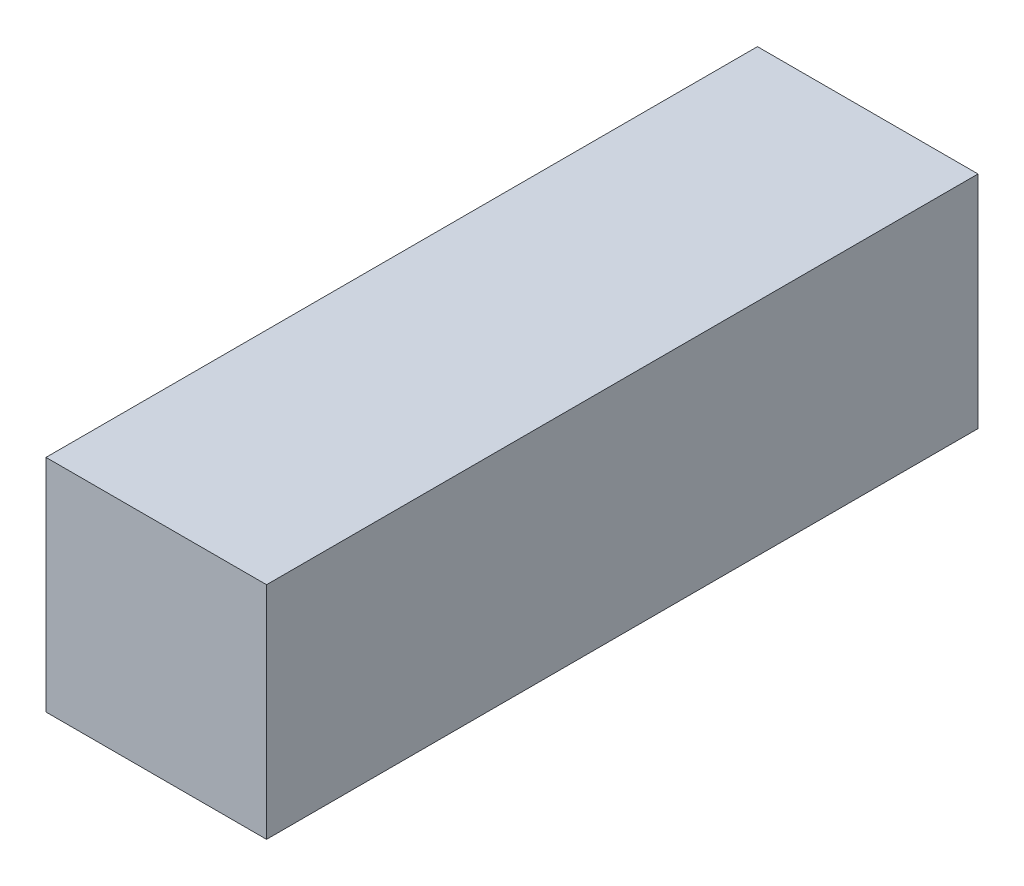
ISO-10303-21;
HEADER;
FILE_DESCRIPTION(('STEP AP214'),'2;1');
FILE_NAME('part.step','',(''),(''),'','','');
FILE_SCHEMA(('AUTOMOTIVE_DESIGN { 1 0 10303 214 1 1 1 1 }'));
ENDSEC;
DATA;
#1=APPLICATION_CONTEXT('core data for automotive mechanical design processes');
#2=APPLICATION_PROTOCOL_DEFINITION('international standard','automotive_design',2000,#1);
#3=PRODUCT_CONTEXT('',#1,'mechanical');
#4=PRODUCT('Part','Part','',(#3));
#5=PRODUCT_RELATED_PRODUCT_CATEGORY('part','',(#4));
#6=PRODUCT_DEFINITION_FORMATION('','',#4);
#7=PRODUCT_DEFINITION_CONTEXT('part definition',#1,'design');
#8=PRODUCT_DEFINITION('design','',#6,#7);
#9=PRODUCT_DEFINITION_SHAPE('','',#8);
#10=(LENGTH_UNIT() NAMED_UNIT(*) SI_UNIT(.MILLI.,.METRE.));
#11=(NAMED_UNIT(*) PLANE_ANGLE_UNIT() SI_UNIT($,.RADIAN.));
#12=(NAMED_UNIT(*) SI_UNIT($,.STERADIAN.) SOLID_ANGLE_UNIT());
#13=UNCERTAINTY_MEASURE_WITH_UNIT(LENGTH_MEASURE(1.E-05),#10,'distance_accuracy_value','');
#14=(GEOMETRIC_REPRESENTATION_CONTEXT(3) GLOBAL_UNCERTAINTY_ASSIGNED_CONTEXT((#13)) GLOBAL_UNIT_ASSIGNED_CONTEXT((#10,
#11,#12)) REPRESENTATION_CONTEXT('',''));
#15=CARTESIAN_POINT('',(0.,0.,0.));
#16=DIRECTION('',(0.,0.,1.));
#17=DIRECTION('',(1.,0.,0.));
#18=AXIS2_PLACEMENT_3D('',#15,#16,#17);
#19=CARTESIAN_POINT('',(3.1,3.1,20.));
#20=DIRECTION('',(-1.,0.,0.));
#21=DIRECTION('',(0.,-1.,0.));
#22=AXIS2_PLACEMENT_3D('',#19,#20,#21);
#23=PLANE('',#22);
#24=DIRECTION('',(0.,1.,0.));
#25=VECTOR('',#24,1.);
#26=CARTESIAN_POINT('',(3.1,3.1,0.));
#27=LINE('',#26,#25);
#28=CARTESIAN_POINT('',(3.1,-3.1,0.));
#29=VERTEX_POINT('',#28);
#30=CARTESIAN_POINT('',(3.1,3.1,0.));
#31=VERTEX_POINT('',#30);
#32=EDGE_CURVE('E100',#29,#31,#27,.T.);
#33=ORIENTED_EDGE('',*,*,#32,.T.);
#34=DIRECTION('',(0.,0.,-1.));
#35=VECTOR('',#34,1.);
#36=CARTESIAN_POINT('',(3.1,3.1,20.));
#37=LINE('',#36,#35);
#38=CARTESIAN_POINT('',(3.1,3.1,20.));
#39=VERTEX_POINT('',#38);
#40=EDGE_CURVE('E11',#39,#31,#37,.T.);
#41=ORIENTED_EDGE('',*,*,#40,.F.);
#42=DIRECTION('',(0.,1.,0.));
#43=VECTOR('',#42,1.);
#44=CARTESIAN_POINT('',(3.1,3.1,20.));
#45=LINE('',#44,#43);
#46=CARTESIAN_POINT('',(3.1,-3.1,20.));
#47=VERTEX_POINT('',#46);
#48=EDGE_CURVE('E88',#47,#39,#45,.T.);
#49=ORIENTED_EDGE('',*,*,#48,.F.);
#50=DIRECTION('',(0.,0.,-1.));
#51=VECTOR('',#50,1.);
#52=CARTESIAN_POINT('',(3.1,-3.1,20.));
#53=LINE('',#52,#51);
#54=EDGE_CURVE('E96',#47,#29,#53,.T.);
#55=ORIENTED_EDGE('',*,*,#54,.T.);
#56=EDGE_LOOP('',(#33,#41,#49,#55));
#57=FACE_BOUND('',#56,.T.);
#58=ADVANCED_FACE('F37',(#57),#23,.F.);
#59=CARTESIAN_POINT('',(-3.1,3.1,20.));
#60=DIRECTION('',(0.,-1.,0.));
#61=DIRECTION('',(0.,0.,-1.));
#62=AXIS2_PLACEMENT_3D('',#59,#60,#61);
#63=PLANE('',#62);
#64=DIRECTION('',(-1.,0.,0.));
#65=VECTOR('',#64,1.);
#66=CARTESIAN_POINT('',(-3.1,3.1,0.));
#67=LINE('',#66,#65);
#68=CARTESIAN_POINT('',(-3.1,3.1,0.));
#69=VERTEX_POINT('',#68);
#70=EDGE_CURVE('E92',#31,#69,#67,.T.);
#71=ORIENTED_EDGE('',*,*,#70,.T.);
#72=DIRECTION('',(0.,0.,-1.));
#73=VECTOR('',#72,1.);
#74=CARTESIAN_POINT('',(-3.1,3.1,20.));
#75=LINE('',#74,#73);
#76=CARTESIAN_POINT('',(-3.1,3.1,20.));
#77=VERTEX_POINT('',#76);
#78=EDGE_CURVE('E45',#77,#69,#75,.T.);
#79=ORIENTED_EDGE('',*,*,#78,.F.);
#80=DIRECTION('',(-1.,0.,0.));
#81=VECTOR('',#80,1.);
#82=CARTESIAN_POINT('',(-3.1,3.1,20.));
#83=LINE('',#82,#81);
#84=EDGE_CURVE('E83',#39,#77,#83,.T.);
#85=ORIENTED_EDGE('',*,*,#84,.F.);
#86=ORIENTED_EDGE('',*,*,#40,.T.);
#87=EDGE_LOOP('',(#71,#79,#85,#86));
#88=FACE_BOUND('',#87,.T.);
#89=ADVANCED_FACE('F91',(#88),#63,.F.);
#90=CARTESIAN_POINT('',(-3.1,3.1,20.));
#91=DIRECTION('',(1.,0.,0.));
#92=DIRECTION('',(0.,1.,0.));
#93=AXIS2_PLACEMENT_3D('',#90,#91,#92);
#94=PLANE('',#93);
#95=DIRECTION('',(0.,-1.,0.));
#96=VECTOR('',#95,1.);
#97=CARTESIAN_POINT('',(-3.1,3.1,0.));
#98=LINE('',#97,#96);
#99=CARTESIAN_POINT('',(-3.1,-3.1,0.));
#100=VERTEX_POINT('',#99);
#101=EDGE_CURVE('E70',#69,#100,#98,.T.);
#102=ORIENTED_EDGE('',*,*,#101,.T.);
#103=DIRECTION('',(0.,0.,-1.));
#104=VECTOR('',#103,1.);
#105=CARTESIAN_POINT('',(-3.1,-3.1,20.));
#106=LINE('',#105,#104);
#107=CARTESIAN_POINT('',(-3.1,-3.1,20.));
#108=VERTEX_POINT('',#107);
#109=EDGE_CURVE('E93',#108,#100,#106,.T.);
#110=ORIENTED_EDGE('',*,*,#109,.F.);
#111=DIRECTION('',(0.,-1.,0.));
#112=VECTOR('',#111,1.);
#113=CARTESIAN_POINT('',(-3.1,3.1,20.));
#114=LINE('',#113,#112);
#115=EDGE_CURVE('E86',#77,#108,#114,.T.);
#116=ORIENTED_EDGE('',*,*,#115,.F.);
#117=ORIENTED_EDGE('',*,*,#78,.T.);
#118=EDGE_LOOP('',(#102,#110,#116,#117));
#119=FACE_BOUND('',#118,.T.);
#120=ADVANCED_FACE('F94',(#119),#94,.F.);
#121=CARTESIAN_POINT('',(-3.1,-3.1,20.));
#122=DIRECTION('',(0.,1.,0.));
#123=DIRECTION('',(0.,0.,1.));
#124=AXIS2_PLACEMENT_3D('',#121,#122,#123);
#125=PLANE('',#124);
#126=DIRECTION('',(1.,0.,0.));
#127=VECTOR('',#126,1.);
#128=CARTESIAN_POINT('',(-3.1,-3.1,0.));
#129=LINE('',#128,#127);
#130=EDGE_CURVE('E76',#100,#29,#129,.T.);
#131=ORIENTED_EDGE('',*,*,#130,.T.);
#132=ORIENTED_EDGE('',*,*,#54,.F.);
#133=DIRECTION('',(1.,0.,0.));
#134=VECTOR('',#133,1.);
#135=CARTESIAN_POINT('',(-3.1,-3.1,20.));
#136=LINE('',#135,#134);
#137=EDGE_CURVE('E53',#108,#47,#136,.T.);
#138=ORIENTED_EDGE('',*,*,#137,.F.);
#139=ORIENTED_EDGE('',*,*,#109,.T.);
#140=EDGE_LOOP('',(#131,#132,#138,#139));
#141=FACE_BOUND('',#140,.T.);
#142=ADVANCED_FACE('F107',(#141),#125,.F.);
#143=CARTESIAN_POINT('',(0.,0.,20.));
#144=DIRECTION('',(0.,0.,1.));
#145=DIRECTION('',(1.,0.,0.));
#146=AXIS2_PLACEMENT_3D('',#143,#144,#145);
#147=PLANE('',#146);
#148=ORIENTED_EDGE('',*,*,#48,.T.);
#149=ORIENTED_EDGE('',*,*,#84,.T.);
#150=ORIENTED_EDGE('',*,*,#115,.T.);
#151=ORIENTED_EDGE('',*,*,#137,.T.);
#152=EDGE_LOOP('',(#148,#149,#150,#151));
#153=FACE_BOUND('',#152,.T.);
#154=ADVANCED_FACE('F84',(#153),#147,.T.);
#155=CARTESIAN_POINT('',(0.,0.,0.));
#156=DIRECTION('',(0.,0.,1.));
#157=DIRECTION('',(1.,0.,0.));
#158=AXIS2_PLACEMENT_3D('',#155,#156,#157);
#159=PLANE('',#158);
#160=ORIENTED_EDGE('',*,*,#32,.F.);
#161=ORIENTED_EDGE('',*,*,#130,.F.);
#162=ORIENTED_EDGE('',*,*,#101,.F.);
#163=ORIENTED_EDGE('',*,*,#70,.F.);
#164=EDGE_LOOP('',(#160,#161,#162,#163));
#165=FACE_BOUND('',#164,.T.);
#166=ADVANCED_FACE('F110',(#165),#159,.F.);
#167=CLOSED_SHELL('',(#58,#89,#120,#142,#154,#166));
#168=MANIFOLD_SOLID_BREP('B2',#167);
#169=ADVANCED_BREP_SHAPE_REPRESENTATION('',(#18,#168),#14);
#170=SHAPE_DEFINITION_REPRESENTATION(#9,#169);
ENDSEC;
END-ISO-10303-21;
